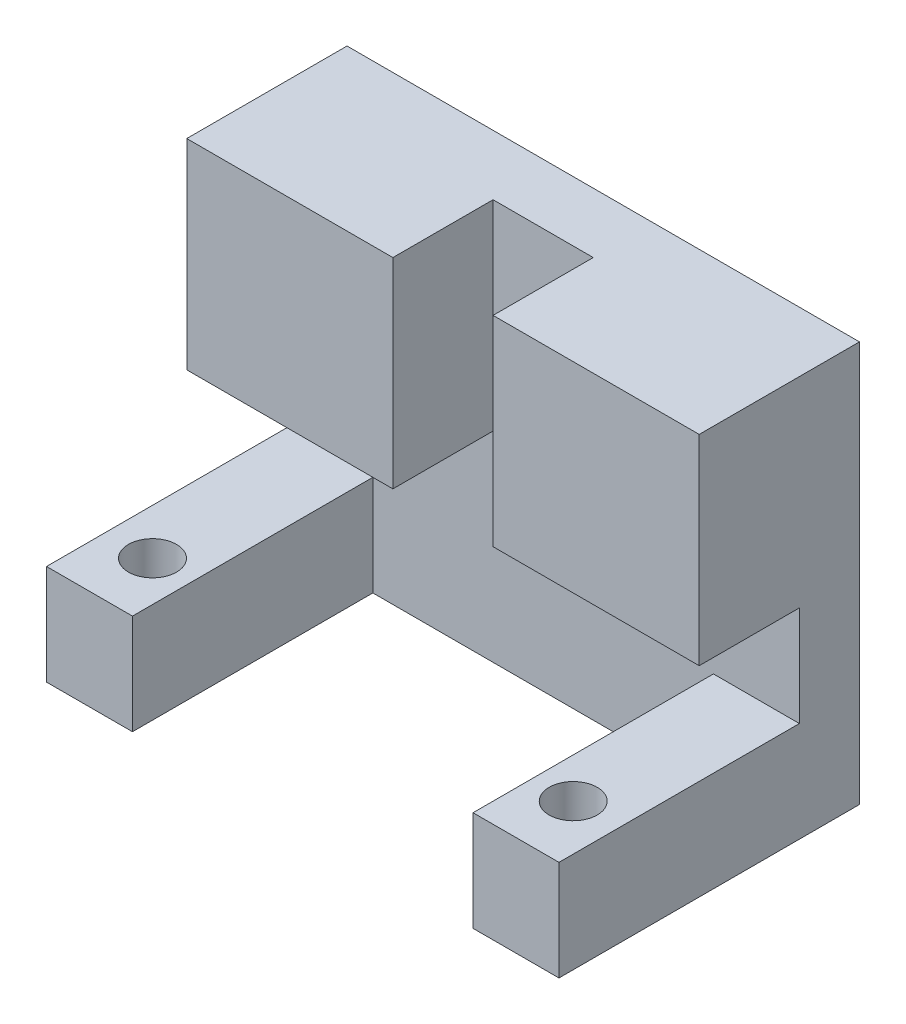
ISO-10303-21;
HEADER;
FILE_DESCRIPTION(('STEP AP214'),'2;1');
FILE_NAME('part.step','',(''),(''),'','','');
FILE_SCHEMA(('AUTOMOTIVE_DESIGN { 1 0 10303 214 1 1 1 1 }'));
ENDSEC;
DATA;
#1=APPLICATION_CONTEXT('core data for automotive mechanical design processes');
#2=APPLICATION_PROTOCOL_DEFINITION('international standard','automotive_design',2000,#1);
#3=PRODUCT_CONTEXT('',#1,'mechanical');
#4=PRODUCT('Part','Part','',(#3));
#5=PRODUCT_RELATED_PRODUCT_CATEGORY('part','',(#4));
#6=PRODUCT_DEFINITION_FORMATION('','',#4);
#7=PRODUCT_DEFINITION_CONTEXT('part definition',#1,'design');
#8=PRODUCT_DEFINITION('design','',#6,#7);
#9=PRODUCT_DEFINITION_SHAPE('','',#8);
#10=(LENGTH_UNIT() NAMED_UNIT(*) SI_UNIT(.MILLI.,.METRE.));
#11=(NAMED_UNIT(*) PLANE_ANGLE_UNIT() SI_UNIT($,.RADIAN.));
#12=(NAMED_UNIT(*) SI_UNIT($,.STERADIAN.) SOLID_ANGLE_UNIT());
#13=UNCERTAINTY_MEASURE_WITH_UNIT(LENGTH_MEASURE(1.E-05),#10,'distance_accuracy_value','');
#14=(GEOMETRIC_REPRESENTATION_CONTEXT(3) GLOBAL_UNCERTAINTY_ASSIGNED_CONTEXT((#13)) GLOBAL_UNIT_ASSIGNED_CONTEXT((#10,
#11,#12)) REPRESENTATION_CONTEXT('',''));
#15=CARTESIAN_POINT('',(0.,0.,0.));
#16=DIRECTION('',(0.,0.,1.));
#17=DIRECTION('',(1.,0.,0.));
#18=AXIS2_PLACEMENT_3D('',#15,#16,#17);
#19=CARTESIAN_POINT('',(0.,0.,15.));
#20=DIRECTION('',(0.,0.,1.));
#21=DIRECTION('',(1.,0.,0.));
#22=AXIS2_PLACEMENT_3D('',#19,#20,#21);
#23=PLANE('',#22);
#24=DIRECTION('',(0.,1.,0.));
#25=VECTOR('',#24,1.);
#26=CARTESIAN_POINT('',(8.5,-10.,15.));
#27=LINE('',#26,#25);
#28=CARTESIAN_POINT('',(8.5,-10.,15.));
#29=VERTEX_POINT('',#28);
#30=CARTESIAN_POINT('',(8.5,-5.,15.));
#31=VERTEX_POINT('',#30);
#32=EDGE_CURVE('E181',#29,#31,#27,.T.);
#33=ORIENTED_EDGE('',*,*,#32,.F.);
#34=DIRECTION('',(1.,0.,0.));
#35=VECTOR('',#34,1.);
#36=CARTESIAN_POINT('',(-12.79,-10.,15.));
#37=LINE('',#36,#35);
#38=CARTESIAN_POINT('',(12.79,-10.,15.));
#39=VERTEX_POINT('',#38);
#40=EDGE_CURVE('E174',#29,#39,#37,.T.);
#41=ORIENTED_EDGE('',*,*,#40,.T.);
#42=DIRECTION('',(0.,1.,0.));
#43=VECTOR('',#42,1.);
#44=CARTESIAN_POINT('',(12.79,10.,15.));
#45=LINE('',#44,#43);
#46=CARTESIAN_POINT('',(12.79,-5.,15.));
#47=VERTEX_POINT('',#46);
#48=EDGE_CURVE('E260',#39,#47,#45,.T.);
#49=ORIENTED_EDGE('',*,*,#48,.T.);
#50=DIRECTION('',(1.,0.,0.));
#51=VECTOR('',#50,1.);
#52=CARTESIAN_POINT('',(12.79,-5.,15.));
#53=LINE('',#52,#51);
#54=EDGE_CURVE('E234',#31,#47,#53,.T.);
#55=ORIENTED_EDGE('',*,*,#54,.F.);
#56=EDGE_LOOP('',(#33,#41,#49,#55));
#57=FACE_BOUND('',#56,.T.);
#58=ADVANCED_FACE('F41',(#57),#23,.T.);
#59=CARTESIAN_POINT('',(12.79,-5.,8.));
#60=DIRECTION('',(0.,-1.,0.));
#61=DIRECTION('',(1.,0.,0.));
#62=AXIS2_PLACEMENT_3D('',#59,#60,#61);
#63=PLANE('',#62);
#64=CARTESIAN_POINT('',(10.5,-5.,12.));
#65=DIRECTION('',(0.,1.,0.));
#66=DIRECTION('',(0.,0.,1.));
#67=AXIS2_PLACEMENT_3D('',#64,#65,#66);
#68=CIRCLE('',#67,1.19999999999999);
#69=CARTESIAN_POINT('',(10.5,-5.,13.2));
#70=VERTEX_POINT('',#69);
#71=EDGE_CURVE('E183',#70,#70,#68,.T.);
#72=ORIENTED_EDGE('',*,*,#71,.F.);
#73=EDGE_LOOP('',(#72));
#74=FACE_BOUND('',#73,.T.);
#75=DIRECTION('',(1.,0.,0.));
#76=VECTOR('',#75,1.);
#77=CARTESIAN_POINT('',(-12.79,-5.,3.));
#78=LINE('',#77,#76);
#79=CARTESIAN_POINT('',(8.5,-5.,3.));
#80=VERTEX_POINT('',#79);
#81=CARTESIAN_POINT('',(12.79,-5.,3.));
#82=VERTEX_POINT('',#81);
#83=EDGE_CURVE('E227',#80,#82,#78,.T.);
#84=ORIENTED_EDGE('',*,*,#83,.F.);
#85=DIRECTION('',(0.,0.,-1.));
#86=VECTOR('',#85,1.);
#87=CARTESIAN_POINT('',(8.49999999999999,-5.,3.));
#88=LINE('',#87,#86);
#89=EDGE_CURVE('E56',#31,#80,#88,.T.);
#90=ORIENTED_EDGE('',*,*,#89,.F.);
#91=ORIENTED_EDGE('',*,*,#54,.T.);
#92=DIRECTION('',(0.,0.,1.));
#93=VECTOR('',#92,1.);
#94=CARTESIAN_POINT('',(12.79,-5.,8.));
#95=LINE('',#94,#93);
#96=EDGE_CURVE('E255',#82,#47,#95,.T.);
#97=ORIENTED_EDGE('',*,*,#96,.F.);
#98=EDGE_LOOP('',(#84,#90,#91,#97));
#99=FACE_BOUND('',#98,.T.);
#100=ADVANCED_FACE('F308',(#74,#99),#63,.F.);
#101=CARTESIAN_POINT('',(0.,0.,8.));
#102=DIRECTION('',(0.,0.,-1.));
#103=DIRECTION('',(-1.,0.,0.));
#104=AXIS2_PLACEMENT_3D('',#101,#102,#103);
#105=PLANE('',#104);
#106=DIRECTION('',(-1.,0.,0.));
#107=VECTOR('',#106,1.);
#108=CARTESIAN_POINT('',(12.79,10.,8.));
#109=LINE('',#108,#107);
#110=CARTESIAN_POINT('',(12.79,10.,8.));
#111=VERTEX_POINT('',#110);
#112=CARTESIAN_POINT('',(2.5,10.,8.));
#113=VERTEX_POINT('',#112);
#114=EDGE_CURVE('E246',#111,#113,#109,.T.);
#115=ORIENTED_EDGE('',*,*,#114,.T.);
#116=DIRECTION('',(0.,1.,0.));
#117=VECTOR('',#116,1.);
#118=CARTESIAN_POINT('',(2.5,-10.001,8.));
#119=LINE('',#118,#117);
#120=CARTESIAN_POINT('',(2.5,0.,8.));
#121=VERTEX_POINT('',#120);
#122=EDGE_CURVE('E202',#121,#113,#119,.T.);
#123=ORIENTED_EDGE('',*,*,#122,.F.);
#124=DIRECTION('',(1.,0.,0.));
#125=VECTOR('',#124,1.);
#126=CARTESIAN_POINT('',(-12.79,0.,8.));
#127=LINE('',#126,#125);
#128=CARTESIAN_POINT('',(12.79,0.,8.));
#129=VERTEX_POINT('',#128);
#130=EDGE_CURVE('E235',#121,#129,#127,.T.);
#131=ORIENTED_EDGE('',*,*,#130,.T.);
#132=DIRECTION('',(0.,1.,0.));
#133=VECTOR('',#132,1.);
#134=CARTESIAN_POINT('',(12.79,10.,8.));
#135=LINE('',#134,#133);
#136=EDGE_CURVE('E242',#129,#111,#135,.T.);
#137=ORIENTED_EDGE('',*,*,#136,.T.);
#138=EDGE_LOOP('',(#115,#123,#131,#137));
#139=FACE_BOUND('',#138,.T.);
#140=ADVANCED_FACE('F320',(#139),#105,.F.);
#141=CARTESIAN_POINT('',(-12.79,0.,8.));
#142=DIRECTION('',(0.,1.,0.));
#143=DIRECTION('',(-1.,0.,0.));
#144=AXIS2_PLACEMENT_3D('',#141,#142,#143);
#145=PLANE('',#144);
#146=ORIENTED_EDGE('',*,*,#130,.F.);
#147=DIRECTION('',(0.,0.,1.));
#148=VECTOR('',#147,1.);
#149=CARTESIAN_POINT('',(2.5,0.,8.));
#150=LINE('',#149,#148);
#151=CARTESIAN_POINT('',(2.5,0.,3.));
#152=VERTEX_POINT('',#151);
#153=EDGE_CURVE('E208',#152,#121,#150,.T.);
#154=ORIENTED_EDGE('',*,*,#153,.F.);
#155=DIRECTION('',(1.,0.,0.));
#156=VECTOR('',#155,1.);
#157=CARTESIAN_POINT('',(-12.79,0.,3.));
#158=LINE('',#157,#156);
#159=CARTESIAN_POINT('',(12.79,0.,3.));
#160=VERTEX_POINT('',#159);
#161=EDGE_CURVE('E239',#152,#160,#158,.T.);
#162=ORIENTED_EDGE('',*,*,#161,.T.);
#163=DIRECTION('',(0.,0.,1.));
#164=VECTOR('',#163,1.);
#165=CARTESIAN_POINT('',(12.79,0.,8.));
#166=LINE('',#165,#164);
#167=EDGE_CURVE('E224',#160,#129,#166,.T.);
#168=ORIENTED_EDGE('',*,*,#167,.T.);
#169=EDGE_LOOP('',(#146,#154,#162,#168));
#170=FACE_BOUND('',#169,.T.);
#171=ADVANCED_FACE('F313',(#170),#145,.F.);
#172=CARTESIAN_POINT('',(12.79,10.,15.));
#173=DIRECTION('',(-1.,0.,0.));
#174=DIRECTION('',(0.,0.,1.));
#175=AXIS2_PLACEMENT_3D('',#172,#173,#174);
#176=PLANE('',#175);
#177=ORIENTED_EDGE('',*,*,#136,.F.);
#178=ORIENTED_EDGE('',*,*,#167,.F.);
#179=DIRECTION('',(0.,1.,0.));
#180=VECTOR('',#179,1.);
#181=CARTESIAN_POINT('',(12.79,-5.,3.));
#182=LINE('',#181,#180);
#183=EDGE_CURVE('E219',#82,#160,#182,.T.);
#184=ORIENTED_EDGE('',*,*,#183,.F.);
#185=ORIENTED_EDGE('',*,*,#96,.T.);
#186=ORIENTED_EDGE('',*,*,#48,.F.);
#187=DIRECTION('',(0.,0.,-1.));
#188=VECTOR('',#187,1.);
#189=CARTESIAN_POINT('',(12.79,-10.,15.));
#190=LINE('',#189,#188);
#191=CARTESIAN_POINT('',(12.79,-10.,0.));
#192=VERTEX_POINT('',#191);
#193=EDGE_CURVE('E269',#39,#192,#190,.T.);
#194=ORIENTED_EDGE('',*,*,#193,.T.);
#195=DIRECTION('',(0.,1.,0.));
#196=VECTOR('',#195,1.);
#197=CARTESIAN_POINT('',(12.79,10.,0.));
#198=LINE('',#197,#196);
#199=CARTESIAN_POINT('',(12.79,10.,0.));
#200=VERTEX_POINT('',#199);
#201=EDGE_CURVE('E258',#192,#200,#198,.T.);
#202=ORIENTED_EDGE('',*,*,#201,.T.);
#203=DIRECTION('',(0.,0.,-1.));
#204=VECTOR('',#203,1.);
#205=CARTESIAN_POINT('',(12.79,10.,15.));
#206=LINE('',#205,#204);
#207=EDGE_CURVE('E11',#111,#200,#206,.T.);
#208=ORIENTED_EDGE('',*,*,#207,.F.);
#209=EDGE_LOOP('',(#177,#178,#184,#185,#186,#194,#202,#208));
#210=FACE_BOUND('',#209,.T.);
#211=ADVANCED_FACE('F43',(#210),#176,.F.);
#212=CARTESIAN_POINT('',(-12.79,10.,15.));
#213=DIRECTION('',(0.,-1.,0.));
#214=DIRECTION('',(0.,0.,-1.));
#215=AXIS2_PLACEMENT_3D('',#212,#213,#214);
#216=PLANE('',#215);
#217=DIRECTION('',(-1.,0.,0.));
#218=VECTOR('',#217,1.);
#219=CARTESIAN_POINT('',(-2.5,10.,3.));
#220=LINE('',#219,#218);
#221=CARTESIAN_POINT('',(2.5,10.,3.));
#222=VERTEX_POINT('',#221);
#223=CARTESIAN_POINT('',(-2.5,10.,3.));
#224=VERTEX_POINT('',#223);
#225=EDGE_CURVE('E199',#222,#224,#220,.T.);
#226=ORIENTED_EDGE('',*,*,#225,.F.);
#227=DIRECTION('',(0.,0.,-1.));
#228=VECTOR('',#227,1.);
#229=CARTESIAN_POINT('',(2.5,10.,8.));
#230=LINE('',#229,#228);
#231=EDGE_CURVE('E203',#113,#222,#230,.T.);
#232=ORIENTED_EDGE('',*,*,#231,.F.);
#233=ORIENTED_EDGE('',*,*,#114,.F.);
#234=ORIENTED_EDGE('',*,*,#207,.T.);
#235=DIRECTION('',(-1.,0.,0.));
#236=VECTOR('',#235,1.);
#237=CARTESIAN_POINT('',(-12.79,10.,0.));
#238=LINE('',#237,#236);
#239=CARTESIAN_POINT('',(-12.79,10.,0.));
#240=VERTEX_POINT('',#239);
#241=EDGE_CURVE('E272',#200,#240,#238,.T.);
#242=ORIENTED_EDGE('',*,*,#241,.T.);
#243=DIRECTION('',(0.,0.,-1.));
#244=VECTOR('',#243,1.);
#245=CARTESIAN_POINT('',(-12.79,10.,15.));
#246=LINE('',#245,#244);
#247=CARTESIAN_POINT('',(-12.79,10.,8.));
#248=VERTEX_POINT('',#247);
#249=EDGE_CURVE('E49',#248,#240,#246,.T.);
#250=ORIENTED_EDGE('',*,*,#249,.F.);
#251=CARTESIAN_POINT('',(-2.5,10.,8.));
#252=VERTEX_POINT('',#251);
#253=EDGE_CURVE('E244',#252,#248,#109,.T.);
#254=ORIENTED_EDGE('',*,*,#253,.F.);
#255=DIRECTION('',(0.,0.,1.));
#256=VECTOR('',#255,1.);
#257=CARTESIAN_POINT('',(-2.5,10.,8.));
#258=LINE('',#257,#256);
#259=EDGE_CURVE('E206',#224,#252,#258,.T.);
#260=ORIENTED_EDGE('',*,*,#259,.F.);
#261=EDGE_LOOP('',(#226,#232,#233,#234,#242,#250,#254,#260));
#262=FACE_BOUND('',#261,.T.);
#263=ADVANCED_FACE('F292',(#262),#216,.F.);
#264=CARTESIAN_POINT('',(-12.79,10.,15.));
#265=DIRECTION('',(1.,0.,0.));
#266=DIRECTION('',(0.,1.,0.));
#267=AXIS2_PLACEMENT_3D('',#264,#265,#266);
#268=PLANE('',#267);
#269=DIRECTION('',(0.,1.,0.));
#270=VECTOR('',#269,1.);
#271=CARTESIAN_POINT('',(-12.79,-5.,3.));
#272=LINE('',#271,#270);
#273=CARTESIAN_POINT('',(-12.79,-5.,3.));
#274=VERTEX_POINT('',#273);
#275=CARTESIAN_POINT('',(-12.79,0.,3.));
#276=VERTEX_POINT('',#275);
#277=EDGE_CURVE('E220',#274,#276,#272,.T.);
#278=ORIENTED_EDGE('',*,*,#277,.T.);
#279=DIRECTION('',(0.,0.,1.));
#280=VECTOR('',#279,1.);
#281=CARTESIAN_POINT('',(-12.79,0.,8.));
#282=LINE('',#281,#280);
#283=CARTESIAN_POINT('',(-12.79,0.,8.));
#284=VERTEX_POINT('',#283);
#285=EDGE_CURVE('E223',#276,#284,#282,.T.);
#286=ORIENTED_EDGE('',*,*,#285,.T.);
#287=DIRECTION('',(0.,-1.,0.));
#288=VECTOR('',#287,1.);
#289=CARTESIAN_POINT('',(-12.79,10.,8.));
#290=LINE('',#289,#288);
#291=EDGE_CURVE('E249',#248,#284,#290,.T.);
#292=ORIENTED_EDGE('',*,*,#291,.F.);
#293=ORIENTED_EDGE('',*,*,#249,.T.);
#294=DIRECTION('',(0.,-1.,0.));
#295=VECTOR('',#294,1.);
#296=CARTESIAN_POINT('',(-12.79,10.,0.));
#297=LINE('',#296,#295);
#298=CARTESIAN_POINT('',(-12.79,-10.,0.));
#299=VERTEX_POINT('',#298);
#300=EDGE_CURVE('E275',#240,#299,#297,.T.);
#301=ORIENTED_EDGE('',*,*,#300,.T.);
#302=DIRECTION('',(0.,0.,-1.));
#303=VECTOR('',#302,1.);
#304=CARTESIAN_POINT('',(-12.79,-10.,15.));
#305=LINE('',#304,#303);
#306=CARTESIAN_POINT('',(-12.79,-10.,15.));
#307=VERTEX_POINT('',#306);
#308=EDGE_CURVE('E280',#307,#299,#305,.T.);
#309=ORIENTED_EDGE('',*,*,#308,.F.);
#310=DIRECTION('',(0.,-1.,0.));
#311=VECTOR('',#310,1.);
#312=CARTESIAN_POINT('',(-12.79,10.,15.));
#313=LINE('',#312,#311);
#314=CARTESIAN_POINT('',(-12.79,-5.,15.));
#315=VERTEX_POINT('',#314);
#316=EDGE_CURVE('E263',#315,#307,#313,.T.);
#317=ORIENTED_EDGE('',*,*,#316,.F.);
#318=DIRECTION('',(0.,0.,1.));
#319=VECTOR('',#318,1.);
#320=CARTESIAN_POINT('',(-12.79,-5.,8.));
#321=LINE('',#320,#319);
#322=EDGE_CURVE('E252',#274,#315,#321,.T.);
#323=ORIENTED_EDGE('',*,*,#322,.F.);
#324=EDGE_LOOP('',(#278,#286,#292,#293,#301,#309,#317,#323));
#325=FACE_BOUND('',#324,.T.);
#326=ADVANCED_FACE('F285',(#325),#268,.F.);
#327=CARTESIAN_POINT('',(-12.79,-10.,15.));
#328=DIRECTION('',(0.,1.,0.));
#329=DIRECTION('',(0.,0.,1.));
#330=AXIS2_PLACEMENT_3D('',#327,#328,#329);
#331=PLANE('',#330);
#332=ORIENTED_EDGE('',*,*,#40,.F.);
#333=DIRECTION('',(0.,0.,-1.));
#334=VECTOR('',#333,1.);
#335=CARTESIAN_POINT('',(8.49999999999999,-10.,3.));
#336=LINE('',#335,#334);
#337=CARTESIAN_POINT('',(8.49999999999999,-10.,3.));
#338=VERTEX_POINT('',#337);
#339=EDGE_CURVE('E154',#29,#338,#336,.T.);
#340=ORIENTED_EDGE('',*,*,#339,.T.);
#341=DIRECTION('',(-1.,0.,0.));
#342=VECTOR('',#341,1.);
#343=CARTESIAN_POINT('',(8.49999999999999,-10.,3.));
#344=LINE('',#343,#342);
#345=CARTESIAN_POINT('',(-8.5,-10.,3.));
#346=VERTEX_POINT('',#345);
#347=EDGE_CURVE('E162',#338,#346,#344,.T.);
#348=ORIENTED_EDGE('',*,*,#347,.T.);
#349=DIRECTION('',(0.,0.,1.));
#350=VECTOR('',#349,1.);
#351=CARTESIAN_POINT('',(-8.5,-10.,3.));
#352=LINE('',#351,#350);
#353=CARTESIAN_POINT('',(-8.5,-10.,15.));
#354=VERTEX_POINT('',#353);
#355=EDGE_CURVE('E159',#346,#354,#352,.T.);
#356=ORIENTED_EDGE('',*,*,#355,.T.);
#357=EDGE_CURVE('E266',#307,#354,#37,.T.);
#358=ORIENTED_EDGE('',*,*,#357,.F.);
#359=ORIENTED_EDGE('',*,*,#308,.T.);
#360=DIRECTION('',(1.,0.,0.));
#361=VECTOR('',#360,1.);
#362=CARTESIAN_POINT('',(-12.79,-10.,0.));
#363=LINE('',#362,#361);
#364=EDGE_CURVE('E264',#299,#192,#363,.T.);
#365=ORIENTED_EDGE('',*,*,#364,.T.);
#366=ORIENTED_EDGE('',*,*,#193,.F.);
#367=EDGE_LOOP('',(#332,#340,#348,#356,#358,#359,#365,#366));
#368=FACE_BOUND('',#367,.T.);
#369=CARTESIAN_POINT('',(10.5,-10.,12.));
#370=DIRECTION('',(0.,1.,0.));
#371=DIRECTION('',(0.,0.,1.));
#372=AXIS2_PLACEMENT_3D('',#369,#370,#371);
#373=CIRCLE('',#372,1.19999999999999);
#374=CARTESIAN_POINT('',(10.5,-10.,13.2));
#375=VERTEX_POINT('',#374);
#376=EDGE_CURVE('E190',#375,#375,#373,.T.);
#377=ORIENTED_EDGE('',*,*,#376,.T.);
#378=EDGE_LOOP('',(#377));
#379=FACE_BOUND('',#378,.T.);
#380=CARTESIAN_POINT('',(-10.5,-10.,12.));
#381=DIRECTION('',(0.,1.,0.));
#382=DIRECTION('',(0.,0.,1.));
#383=AXIS2_PLACEMENT_3D('',#380,#381,#382);
#384=CIRCLE('',#383,1.19999999999999);
#385=CARTESIAN_POINT('',(-10.5,-10.,13.2));
#386=VERTEX_POINT('',#385);
#387=EDGE_CURVE('E196',#386,#386,#384,.T.);
#388=ORIENTED_EDGE('',*,*,#387,.T.);
#389=EDGE_LOOP('',(#388));
#390=FACE_BOUND('',#389,.T.);
#391=ADVANCED_FACE('F171',(#368,#379,#390),#331,.F.);
#392=DIRECTION('',(0.,1.,0.));
#393=VECTOR('',#392,1.);
#394=CARTESIAN_POINT('',(-8.5,-10.,15.));
#395=LINE('',#394,#393);
#396=CARTESIAN_POINT('',(-8.5,-5.,15.));
#397=VERTEX_POINT('',#396);
#398=EDGE_CURVE('E184',#354,#397,#395,.T.);
#399=ORIENTED_EDGE('',*,*,#398,.T.);
#400=EDGE_CURVE('E245',#315,#397,#53,.T.);
#401=ORIENTED_EDGE('',*,*,#400,.F.);
#402=ORIENTED_EDGE('',*,*,#316,.T.);
#403=ORIENTED_EDGE('',*,*,#357,.T.);
#404=EDGE_LOOP('',(#399,#401,#402,#403));
#405=FACE_BOUND('',#404,.T.);
#406=ADVANCED_FACE('F335',(#405),#23,.T.);
#407=CARTESIAN_POINT('',(0.,0.,0.));
#408=DIRECTION('',(0.,0.,1.));
#409=DIRECTION('',(1.,0.,0.));
#410=AXIS2_PLACEMENT_3D('',#407,#408,#409);
#411=PLANE('',#410);
#412=ORIENTED_EDGE('',*,*,#201,.F.);
#413=ORIENTED_EDGE('',*,*,#364,.F.);
#414=ORIENTED_EDGE('',*,*,#300,.F.);
#415=ORIENTED_EDGE('',*,*,#241,.F.);
#416=EDGE_LOOP('',(#412,#413,#414,#415));
#417=FACE_BOUND('',#416,.T.);
#418=ADVANCED_FACE('F298',(#417),#411,.F.);
#419=CARTESIAN_POINT('',(-10.5,-5.,12.));
#420=DIRECTION('',(0.,1.,0.));
#421=DIRECTION('',(0.,0.,1.));
#422=AXIS2_PLACEMENT_3D('',#419,#420,#421);
#423=CIRCLE('',#422,1.19999999999999);
#424=CARTESIAN_POINT('',(-10.5,-5.,13.2));
#425=VERTEX_POINT('',#424);
#426=EDGE_CURVE('E193',#425,#425,#423,.T.);
#427=ORIENTED_EDGE('',*,*,#426,.F.);
#428=EDGE_LOOP('',(#427));
#429=FACE_BOUND('',#428,.T.);
#430=ORIENTED_EDGE('',*,*,#400,.T.);
#431=DIRECTION('',(0.,0.,1.));
#432=VECTOR('',#431,1.);
#433=CARTESIAN_POINT('',(-8.5,-5.,3.));
#434=LINE('',#433,#432);
#435=CARTESIAN_POINT('',(-8.5,-5.,3.));
#436=VERTEX_POINT('',#435);
#437=EDGE_CURVE('E175',#436,#397,#434,.T.);
#438=ORIENTED_EDGE('',*,*,#437,.F.);
#439=EDGE_CURVE('E240',#274,#436,#78,.T.);
#440=ORIENTED_EDGE('',*,*,#439,.F.);
#441=ORIENTED_EDGE('',*,*,#322,.T.);
#442=EDGE_LOOP('',(#430,#438,#440,#441));
#443=FACE_BOUND('',#442,.T.);
#444=ADVANCED_FACE('F330',(#429,#443),#63,.F.);
#445=CARTESIAN_POINT('',(-2.5,0.,8.));
#446=VERTEX_POINT('',#445);
#447=EDGE_CURVE('E231',#284,#446,#127,.T.);
#448=ORIENTED_EDGE('',*,*,#447,.T.);
#449=DIRECTION('',(0.,1.,0.));
#450=VECTOR('',#449,1.);
#451=CARTESIAN_POINT('',(-2.5,-10.001,8.));
#452=LINE('',#451,#450);
#453=EDGE_CURVE('E213',#446,#252,#452,.T.);
#454=ORIENTED_EDGE('',*,*,#453,.T.);
#455=ORIENTED_EDGE('',*,*,#253,.T.);
#456=ORIENTED_EDGE('',*,*,#291,.T.);
#457=EDGE_LOOP('',(#448,#454,#455,#456));
#458=FACE_BOUND('',#457,.T.);
#459=ADVANCED_FACE('F356',(#458),#105,.F.);
#460=CARTESIAN_POINT('',(-2.5,0.,3.));
#461=VERTEX_POINT('',#460);
#462=EDGE_CURVE('E236',#276,#461,#158,.T.);
#463=ORIENTED_EDGE('',*,*,#462,.T.);
#464=DIRECTION('',(0.,0.,-1.));
#465=VECTOR('',#464,1.);
#466=CARTESIAN_POINT('',(-2.5,0.,8.));
#467=LINE('',#466,#465);
#468=EDGE_CURVE('E64',#446,#461,#467,.T.);
#469=ORIENTED_EDGE('',*,*,#468,.F.);
#470=ORIENTED_EDGE('',*,*,#447,.F.);
#471=ORIENTED_EDGE('',*,*,#285,.F.);
#472=EDGE_LOOP('',(#463,#469,#470,#471));
#473=FACE_BOUND('',#472,.T.);
#474=ADVANCED_FACE('F325',(#473),#145,.F.);
#475=CARTESIAN_POINT('',(-12.79,-5.,3.));
#476=DIRECTION('',(0.,0.,-1.));
#477=DIRECTION('',(-1.,0.,0.));
#478=AXIS2_PLACEMENT_3D('',#475,#476,#477);
#479=PLANE('',#478);
#480=ORIENTED_EDGE('',*,*,#183,.T.);
#481=ORIENTED_EDGE('',*,*,#161,.F.);
#482=DIRECTION('',(0.,1.,0.));
#483=VECTOR('',#482,1.);
#484=CARTESIAN_POINT('',(2.5,-10.001,3.));
#485=LINE('',#484,#483);
#486=EDGE_CURVE('E214',#152,#222,#485,.T.);
#487=ORIENTED_EDGE('',*,*,#486,.T.);
#488=ORIENTED_EDGE('',*,*,#225,.T.);
#489=DIRECTION('',(0.,1.,0.));
#490=VECTOR('',#489,1.);
#491=CARTESIAN_POINT('',(-2.5,-10.001,3.));
#492=LINE('',#491,#490);
#493=EDGE_CURVE('E211',#461,#224,#492,.T.);
#494=ORIENTED_EDGE('',*,*,#493,.F.);
#495=ORIENTED_EDGE('',*,*,#462,.F.);
#496=ORIENTED_EDGE('',*,*,#277,.F.);
#497=ORIENTED_EDGE('',*,*,#439,.T.);
#498=DIRECTION('',(0.,1.,0.));
#499=VECTOR('',#498,1.);
#500=CARTESIAN_POINT('',(-8.5,-10.,3.));
#501=LINE('',#500,#499);
#502=EDGE_CURVE('E158',#346,#436,#501,.T.);
#503=ORIENTED_EDGE('',*,*,#502,.F.);
#504=ORIENTED_EDGE('',*,*,#347,.F.);
#505=DIRECTION('',(0.,1.,0.));
#506=VECTOR('',#505,1.);
#507=CARTESIAN_POINT('',(8.49999999999999,-10.,3.));
#508=LINE('',#507,#506);
#509=EDGE_CURVE('E150',#338,#80,#508,.T.);
#510=ORIENTED_EDGE('',*,*,#509,.T.);
#511=ORIENTED_EDGE('',*,*,#83,.T.);
#512=EDGE_LOOP('',(#480,#481,#487,#488,#494,#495,#496,#497,#503,#504,#510,#511));
#513=FACE_BOUND('',#512,.T.);
#514=ADVANCED_FACE('F164',(#513),#479,.F.);
#515=CARTESIAN_POINT('',(2.5,-10.001,8.));
#516=DIRECTION('',(1.,0.,0.));
#517=DIRECTION('',(0.,0.,-1.));
#518=AXIS2_PLACEMENT_3D('',#515,#516,#517);
#519=PLANE('',#518);
#520=ORIENTED_EDGE('',*,*,#153,.T.);
#521=ORIENTED_EDGE('',*,*,#122,.T.);
#522=ORIENTED_EDGE('',*,*,#231,.T.);
#523=ORIENTED_EDGE('',*,*,#486,.F.);
#524=EDGE_LOOP('',(#520,#521,#522,#523));
#525=FACE_BOUND('',#524,.T.);
#526=ADVANCED_FACE('F317',(#525),#519,.F.);
#527=CARTESIAN_POINT('',(-2.5,-10.001,8.));
#528=DIRECTION('',(-1.,0.,0.));
#529=DIRECTION('',(0.,0.,1.));
#530=AXIS2_PLACEMENT_3D('',#527,#528,#529);
#531=PLANE('',#530);
#532=ORIENTED_EDGE('',*,*,#468,.T.);
#533=ORIENTED_EDGE('',*,*,#493,.T.);
#534=ORIENTED_EDGE('',*,*,#259,.T.);
#535=ORIENTED_EDGE('',*,*,#453,.F.);
#536=EDGE_LOOP('',(#532,#533,#534,#535));
#537=FACE_BOUND('',#536,.T.);
#538=ADVANCED_FACE('F369',(#537),#531,.F.);
#539=CARTESIAN_POINT('',(-10.5,-5.,12.));
#540=DIRECTION('',(0.,1.,0.));
#541=DIRECTION('',(0.,0.,1.));
#542=AXIS2_PLACEMENT_3D('',#539,#540,#541);
#543=CYLINDRICAL_SURFACE('',#542,1.19999999999999);
#544=ORIENTED_EDGE('',*,*,#387,.F.);
#545=EDGE_LOOP('',(#544));
#546=FACE_BOUND('',#545,.T.);
#547=ORIENTED_EDGE('',*,*,#426,.T.);
#548=EDGE_LOOP('',(#547));
#549=FACE_BOUND('',#548,.T.);
#550=ADVANCED_FACE('F366',(#546,#549),#543,.F.);
#551=CARTESIAN_POINT('',(10.5,-5.,12.));
#552=DIRECTION('',(0.,1.,0.));
#553=DIRECTION('',(0.,0.,1.));
#554=AXIS2_PLACEMENT_3D('',#551,#552,#553);
#555=CYLINDRICAL_SURFACE('',#554,1.19999999999999);
#556=ORIENTED_EDGE('',*,*,#376,.F.);
#557=EDGE_LOOP('',(#556));
#558=FACE_BOUND('',#557,.T.);
#559=ORIENTED_EDGE('',*,*,#71,.T.);
#560=EDGE_LOOP('',(#559));
#561=FACE_BOUND('',#560,.T.);
#562=ADVANCED_FACE('F368',(#558,#561),#555,.F.);
#563=CARTESIAN_POINT('',(8.49999999999999,-10.,3.));
#564=DIRECTION('',(1.,0.,0.));
#565=DIRECTION('',(0.,0.,-1.));
#566=AXIS2_PLACEMENT_3D('',#563,#564,#565);
#567=PLANE('',#566);
#568=ORIENTED_EDGE('',*,*,#89,.T.);
#569=ORIENTED_EDGE('',*,*,#509,.F.);
#570=ORIENTED_EDGE('',*,*,#339,.F.);
#571=ORIENTED_EDGE('',*,*,#32,.T.);
#572=EDGE_LOOP('',(#568,#569,#570,#571));
#573=FACE_BOUND('',#572,.T.);
#574=ADVANCED_FACE('F152',(#573),#567,.F.);
#575=CARTESIAN_POINT('',(-8.5,-10.,3.));
#576=DIRECTION('',(-1.,0.,0.));
#577=DIRECTION('',(0.,-1.,0.));
#578=AXIS2_PLACEMENT_3D('',#575,#576,#577);
#579=PLANE('',#578);
#580=ORIENTED_EDGE('',*,*,#437,.T.);
#581=ORIENTED_EDGE('',*,*,#398,.F.);
#582=ORIENTED_EDGE('',*,*,#355,.F.);
#583=ORIENTED_EDGE('',*,*,#502,.T.);
#584=EDGE_LOOP('',(#580,#581,#582,#583));
#585=FACE_BOUND('',#584,.T.);
#586=ADVANCED_FACE('F333',(#585),#579,.F.);
#587=CLOSED_SHELL('',(#58,#100,#140,#171,#211,#263,#326,#391,#406,#418,#444,#459,#474,#514,#526,
#538,#550,#562,#574,#586));
#588=MANIFOLD_SOLID_BREP('B2',#587);
#589=ADVANCED_BREP_SHAPE_REPRESENTATION('',(#18,#588),#14);
#590=SHAPE_DEFINITION_REPRESENTATION(#9,#589);
ENDSEC;
END-ISO-10303-21;
